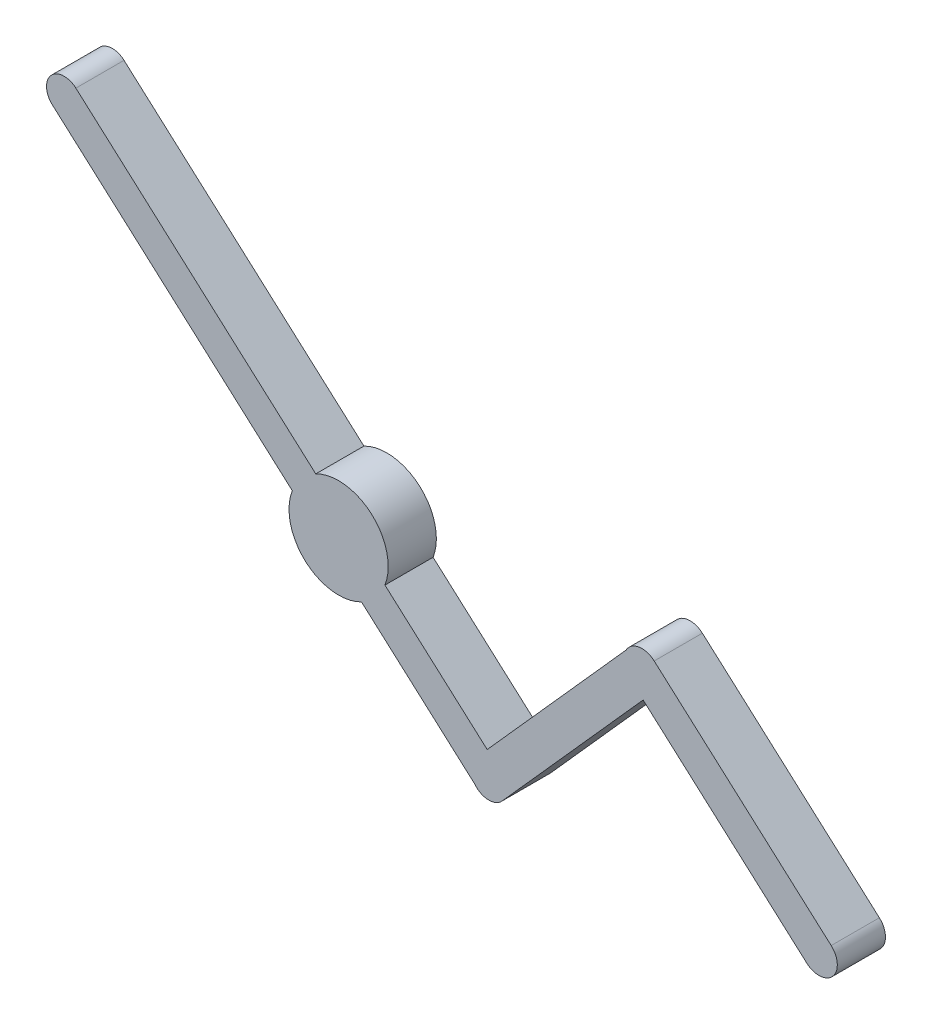
ISO-10303-21;
HEADER;
FILE_DESCRIPTION(('STEP AP214'),'2;1');
FILE_NAME('part.step','',(''),(''),'','','');
FILE_SCHEMA(('AUTOMOTIVE_DESIGN { 1 0 10303 214 1 1 1 1 }'));
ENDSEC;
DATA;
#1=APPLICATION_CONTEXT('core data for automotive mechanical design processes');
#2=APPLICATION_PROTOCOL_DEFINITION('international standard','automotive_design',2000,#1);
#3=PRODUCT_CONTEXT('',#1,'mechanical');
#4=PRODUCT('Part','Part','',(#3));
#5=PRODUCT_RELATED_PRODUCT_CATEGORY('part','',(#4));
#6=PRODUCT_DEFINITION_FORMATION('','',#4);
#7=PRODUCT_DEFINITION_CONTEXT('part definition',#1,'design');
#8=PRODUCT_DEFINITION('design','',#6,#7);
#9=PRODUCT_DEFINITION_SHAPE('','',#8);
#10=(LENGTH_UNIT() NAMED_UNIT(*) SI_UNIT(.MILLI.,.METRE.));
#11=(NAMED_UNIT(*) PLANE_ANGLE_UNIT() SI_UNIT($,.RADIAN.));
#12=(NAMED_UNIT(*) SI_UNIT($,.STERADIAN.) SOLID_ANGLE_UNIT());
#13=UNCERTAINTY_MEASURE_WITH_UNIT(LENGTH_MEASURE(1.E-05),#10,'distance_accuracy_value','');
#14=(GEOMETRIC_REPRESENTATION_CONTEXT(3) GLOBAL_UNCERTAINTY_ASSIGNED_CONTEXT((#13)) GLOBAL_UNIT_ASSIGNED_CONTEXT((#10,
#11,#12)) REPRESENTATION_CONTEXT('',''));
#15=CARTESIAN_POINT('',(0.,0.,0.));
#16=DIRECTION('',(0.,0.,1.));
#17=DIRECTION('',(1.,0.,0.));
#18=AXIS2_PLACEMENT_3D('',#15,#16,#17);
#19=CARTESIAN_POINT('',(144.167279134353,-128.666791198798,2.));
#20=DIRECTION('',(-0.746076463848962,0.665860278204541,0.));
#21=DIRECTION('',(-0.665860278204541,-0.746076463848962,0.));
#22=AXIS2_PLACEMENT_3D('',#19,#20,#21);
#23=PLANE('',#22);
#24=DIRECTION('',(0.665860278204541,0.746076463848962,0.));
#25=VECTOR('',#24,1.);
#26=CARTESIAN_POINT('',(144.167279134353,-128.666791198798,0.));
#27=LINE('',#26,#25);
#28=CARTESIAN_POINT('',(197.074273983325,-69.3860908449162,0.));
#29=VERTEX_POINT('',#28);
#30=CARTESIAN_POINT('',(202.925750043493,-62.8296874819783,0.));
#31=VERTEX_POINT('',#30);
#32=EDGE_CURVE('E148',#29,#31,#27,.T.);
#33=ORIENTED_EDGE('',*,*,#32,.T.);
#34=DIRECTION('',(0.,0.,-1.));
#35=VECTOR('',#34,1.);
#36=CARTESIAN_POINT('',(202.925750043493,-62.8296874819783,2.));
#37=LINE('',#36,#35);
#38=CARTESIAN_POINT('',(202.925750043493,-62.8296874819783,2.));
#39=VERTEX_POINT('',#38);
#40=EDGE_CURVE('E11',#39,#31,#37,.T.);
#41=ORIENTED_EDGE('',*,*,#40,.F.);
#42=DIRECTION('',(0.665860278204541,0.746076463848962,0.));
#43=VECTOR('',#42,1.);
#44=CARTESIAN_POINT('',(144.167279134353,-128.666791198798,2.));
#45=LINE('',#44,#43);
#46=CARTESIAN_POINT('',(197.074273983325,-69.3860908449162,2.));
#47=VERTEX_POINT('',#46);
#48=EDGE_CURVE('E181',#47,#39,#45,.T.);
#49=ORIENTED_EDGE('',*,*,#48,.F.);
#50=DIRECTION('',(0.,0.,-1.));
#51=VECTOR('',#50,1.);
#52=CARTESIAN_POINT('',(197.074273983325,-69.3860908449162,2.));
#53=LINE('',#52,#51);
#54=EDGE_CURVE('E144',#47,#29,#53,.T.);
#55=ORIENTED_EDGE('',*,*,#54,.T.);
#56=EDGE_LOOP('',(#33,#41,#49,#55));
#57=FACE_BOUND('',#56,.T.);
#58=ADVANCED_FACE('F16',(#57),#23,.F.);
#59=CARTESIAN_POINT('',(58.7584709091406,65.8371037168205,2.));
#60=DIRECTION('',(0.665860278204545,0.746076463848959,0.));
#61=DIRECTION('',(-0.746076463848959,0.665860278204545,0.));
#62=AXIS2_PLACEMENT_3D('',#59,#60,#61);
#63=PLANE('',#62);
#64=DIRECTION('',(0.746076463848959,-0.665860278204544,0.));
#65=VECTOR('',#64,1.);
#66=CARTESIAN_POINT('',(58.7584709091406,65.8371037168205,0.));
#67=LINE('',#66,#65);
#68=CARTESIAN_POINT('',(209.719946290777,-68.8933895589126,0.));
#69=VERTEX_POINT('',#68);
#70=EDGE_CURVE('E151',#31,#69,#67,.T.);
#71=ORIENTED_EDGE('',*,*,#70,.T.);
#72=DIRECTION('',(0.,0.,-1.));
#73=VECTOR('',#72,1.);
#74=CARTESIAN_POINT('',(209.719946290777,-68.8933895589126,2.));
#75=LINE('',#74,#73);
#76=CARTESIAN_POINT('',(209.719946290777,-68.8933895589126,2.));
#77=VERTEX_POINT('',#76);
#78=EDGE_CURVE('E24',#77,#69,#75,.T.);
#79=ORIENTED_EDGE('',*,*,#78,.F.);
#80=DIRECTION('',(0.746076463848959,-0.665860278204544,0.));
#81=VECTOR('',#80,1.);
#82=CARTESIAN_POINT('',(58.7584709091406,65.8371037168205,2.));
#83=LINE('',#82,#81);
#84=EDGE_CURVE('E93',#39,#77,#83,.T.);
#85=ORIENTED_EDGE('',*,*,#84,.F.);
#86=ORIENTED_EDGE('',*,*,#40,.T.);
#87=EDGE_LOOP('',(#71,#79,#85,#86));
#88=FACE_BOUND('',#87,.T.);
#89=ADVANCED_FACE('F262',(#88),#63,.F.);
#90=CARTESIAN_POINT('',(210.227354136382,-68.3248542917263,2.));
#91=DIRECTION('',(0.,0.,-1.));
#92=DIRECTION('',(-1.,0.,0.));
#93=AXIS2_PLACEMENT_3D('',#90,#91,#92);
#94=CYLINDRICAL_SURFACE('',#93,0.762033510953083);
#95=CARTESIAN_POINT('',(210.227354136382,-68.3248542917263,0.));
#96=DIRECTION('',(0.,0.,1.));
#97=DIRECTION('',(1.,0.,0.));
#98=AXIS2_PLACEMENT_3D('',#95,#96,#97);
#99=CIRCLE('',#98,0.762033510953083);
#100=CARTESIAN_POINT('',(210.734761981986,-67.75631902454,0.));
#101=VERTEX_POINT('',#100);
#102=EDGE_CURVE('E153',#69,#101,#99,.T.);
#103=ORIENTED_EDGE('',*,*,#102,.T.);
#104=DIRECTION('',(0.,0.,-1.));
#105=VECTOR('',#104,1.);
#106=CARTESIAN_POINT('',(210.734761981986,-67.75631902454,2.));
#107=LINE('',#106,#105);
#108=CARTESIAN_POINT('',(210.734761981986,-67.75631902454,2.));
#109=VERTEX_POINT('',#108);
#110=EDGE_CURVE('E200',#109,#101,#107,.T.);
#111=ORIENTED_EDGE('',*,*,#110,.F.);
#112=CARTESIAN_POINT('',(210.227354136382,-68.3248542917263,2.));
#113=DIRECTION('',(0.,0.,1.));
#114=DIRECTION('',(1.,0.,0.));
#115=AXIS2_PLACEMENT_3D('',#112,#113,#114);
#116=CIRCLE('',#115,0.762033510953083);
#117=EDGE_CURVE('E207',#77,#109,#116,.T.);
#118=ORIENTED_EDGE('',*,*,#117,.F.);
#119=ORIENTED_EDGE('',*,*,#78,.T.);
#120=EDGE_LOOP('',(#103,#111,#118,#119));
#121=FACE_BOUND('',#120,.T.);
#122=ADVANCED_FACE('F205',(#121),#94,.T.);
#123=CARTESIAN_POINT('',(59.7732866003492,66.974174251193,2.));
#124=DIRECTION('',(0.665860278204544,0.74607646384896,0.));
#125=DIRECTION('',(-0.74607646384896,0.665860278204544,0.));
#126=AXIS2_PLACEMENT_3D('',#123,#124,#125);
#127=PLANE('',#126);
#128=DIRECTION('',(0.74607646384896,-0.665860278204544,0.));
#129=VECTOR('',#128,1.);
#130=CARTESIAN_POINT('',(59.7732866003492,66.974174251193,0.));
#131=LINE('',#130,#129);
#132=CARTESIAN_POINT('',(203.385396716601,-61.1971382470234,0.));
#133=VERTEX_POINT('',#132);
#134=EDGE_CURVE('E156',#133,#101,#131,.T.);
#135=ORIENTED_EDGE('',*,*,#134,.F.);
#136=DIRECTION('',(0.,0.,-1.));
#137=VECTOR('',#136,1.);
#138=CARTESIAN_POINT('',(203.385396716601,-61.1971382470234,2.));
#139=LINE('',#138,#137);
#140=CARTESIAN_POINT('',(203.385396716601,-61.1971382470234,2.));
#141=VERTEX_POINT('',#140);
#142=EDGE_CURVE('E198',#141,#133,#139,.T.);
#143=ORIENTED_EDGE('',*,*,#142,.F.);
#144=DIRECTION('',(0.74607646384896,-0.665860278204544,0.));
#145=VECTOR('',#144,1.);
#146=CARTESIAN_POINT('',(59.7732866003492,66.974174251193,2.));
#147=LINE('',#146,#145);
#148=EDGE_CURVE('E218',#141,#109,#147,.T.);
#149=ORIENTED_EDGE('',*,*,#148,.T.);
#150=ORIENTED_EDGE('',*,*,#110,.T.);
#151=EDGE_LOOP('',(#135,#143,#149,#150));
#152=FACE_BOUND('',#151,.T.);
#153=ADVANCED_FACE('F214',(#152),#127,.T.);
#154=CARTESIAN_POINT('',(202.877988870997,-61.7656735142097,2.));
#155=DIRECTION('',(0.,0.,-1.));
#156=DIRECTION('',(-1.,0.,0.));
#157=AXIS2_PLACEMENT_3D('',#154,#155,#156);
#158=CYLINDRICAL_SURFACE('',#157,0.762033510953078);
#159=CARTESIAN_POINT('',(202.877988870997,-61.7656735142097,0.));
#160=DIRECTION('',(0.,0.,1.));
#161=DIRECTION('',(1.,0.,0.));
#162=AXIS2_PLACEMENT_3D('',#159,#160,#161);
#163=CIRCLE('',#162,0.762033510953078);
#164=CARTESIAN_POINT('',(202.213441705855,-61.3927497457028,0.));
#165=VERTEX_POINT('',#164);
#166=EDGE_CURVE('E159',#133,#165,#163,.T.);
#167=ORIENTED_EDGE('',*,*,#166,.T.);
#168=DIRECTION('',(0.,0.,-1.));
#169=VECTOR('',#168,1.);
#170=CARTESIAN_POINT('',(202.213441705855,-61.3927497457028,2.));
#171=LINE('',#170,#169);
#172=CARTESIAN_POINT('',(202.213441705855,-61.3927497457028,2.));
#173=VERTEX_POINT('',#172);
#174=EDGE_CURVE('E196',#173,#165,#171,.T.);
#175=ORIENTED_EDGE('',*,*,#174,.F.);
#176=CARTESIAN_POINT('',(202.877988870997,-61.7656735142097,2.));
#177=DIRECTION('',(0.,0.,1.));
#178=DIRECTION('',(1.,0.,0.));
#179=AXIS2_PLACEMENT_3D('',#176,#177,#178);
#180=CIRCLE('',#179,0.762033510953078);
#181=EDGE_CURVE('E219',#141,#173,#180,.T.);
#182=ORIENTED_EDGE('',*,*,#181,.F.);
#183=ORIENTED_EDGE('',*,*,#142,.T.);
#184=EDGE_LOOP('',(#167,#175,#182,#183));
#185=FACE_BOUND('',#184,.T.);
#186=ADVANCED_FACE('F275',(#185),#158,.T.);
#187=CARTESIAN_POINT('',(143.056941098152,-127.675833797634,2.));
#188=DIRECTION('',(-0.746076463848961,0.665860278204543,0.));
#189=DIRECTION('',(-0.665860278204543,-0.746076463848961,0.));
#190=AXIS2_PLACEMENT_3D('',#187,#188,#189);
#191=PLANE('',#190);
#192=DIRECTION('',(0.665860278204543,0.746076463848961,0.));
#193=VECTOR('',#192,1.);
#194=CARTESIAN_POINT('',(143.056941098152,-127.675833797634,0.));
#195=LINE('',#194,#193);
#196=CARTESIAN_POINT('',(196.450966632525,-67.8494301731958,0.));
#197=VERTEX_POINT('',#196);
#198=EDGE_CURVE('E162',#197,#165,#195,.T.);
#199=ORIENTED_EDGE('',*,*,#198,.F.);
#200=DIRECTION('',(0.,0.,-1.));
#201=VECTOR('',#200,1.);
#202=CARTESIAN_POINT('',(196.450966632525,-67.8494301731958,2.));
#203=LINE('',#202,#201);
#204=CARTESIAN_POINT('',(196.450966632525,-67.8494301731958,2.));
#205=VERTEX_POINT('',#204);
#206=EDGE_CURVE('E194',#205,#197,#203,.T.);
#207=ORIENTED_EDGE('',*,*,#206,.F.);
#208=DIRECTION('',(0.665860278204543,0.746076463848961,0.));
#209=VECTOR('',#208,1.);
#210=CARTESIAN_POINT('',(143.056941098152,-127.675833797634,2.));
#211=LINE('',#210,#209);
#212=EDGE_CURVE('E221',#205,#173,#211,.T.);
#213=ORIENTED_EDGE('',*,*,#212,.T.);
#214=ORIENTED_EDGE('',*,*,#174,.T.);
#215=EDGE_LOOP('',(#199,#207,#213,#214));
#216=FACE_BOUND('',#215,.T.);
#217=ADVANCED_FACE('F278',(#216),#191,.T.);
#218=CARTESIAN_POINT('',(53.3940255343725,59.8264036244382,2.));
#219=DIRECTION('',(0.665860278204543,0.74607646384896,0.));
#220=DIRECTION('',(-0.74607646384896,0.665860278204543,0.));
#221=AXIS2_PLACEMENT_3D('',#218,#219,#220);
#222=PLANE('',#221);
#223=DIRECTION('',(0.74607646384896,-0.665860278204543,0.));
#224=VECTOR('',#223,1.);
#225=CARTESIAN_POINT('',(53.3940255343725,59.8264036244382,0.));
#226=LINE('',#225,#224);
#227=CARTESIAN_POINT('',(192.204166739988,-64.0592350726353,0.));
#228=VERTEX_POINT('',#227);
#229=EDGE_CURVE('E165',#228,#197,#226,.T.);
#230=ORIENTED_EDGE('',*,*,#229,.F.);
#231=DIRECTION('',(0.,0.,-1.));
#232=VECTOR('',#231,1.);
#233=CARTESIAN_POINT('',(192.204166739988,-64.0592350726353,2.));
#234=LINE('',#233,#232);
#235=CARTESIAN_POINT('',(192.204166739988,-64.0592350726353,2.));
#236=VERTEX_POINT('',#235);
#237=EDGE_CURVE('E192',#236,#228,#234,.T.);
#238=ORIENTED_EDGE('',*,*,#237,.F.);
#239=DIRECTION('',(0.74607646384896,-0.665860278204543,0.));
#240=VECTOR('',#239,1.);
#241=CARTESIAN_POINT('',(53.3940255343725,59.8264036244382,2.));
#242=LINE('',#241,#240);
#243=EDGE_CURVE('E228',#236,#205,#242,.T.);
#244=ORIENTED_EDGE('',*,*,#243,.T.);
#245=ORIENTED_EDGE('',*,*,#206,.T.);
#246=EDGE_LOOP('',(#230,#238,#244,#245));
#247=FACE_BOUND('',#246,.T.);
#248=ADVANCED_FACE('F282',(#247),#222,.T.);
#249=CARTESIAN_POINT('',(190.281006735768,-63.3232178840935,2.));
#250=DIRECTION('',(0.,0.,-1.));
#251=DIRECTION('',(-1.,0.,0.));
#252=AXIS2_PLACEMENT_3D('',#249,#250,#251);
#253=CYLINDRICAL_SURFACE('',#252,2.05919054573817);
#254=CARTESIAN_POINT('',(190.281006735768,-63.3232178840935,0.));
#255=DIRECTION('',(0.,0.,1.));
#256=DIRECTION('',(1.,0.,0.));
#257=AXIS2_PLACEMENT_3D('',#254,#255,#256);
#258=CIRCLE('',#257,2.05919054573817);
#259=CARTESIAN_POINT('',(189.33190810235,-61.49579415444,0.));
#260=VERTEX_POINT('',#259);
#261=EDGE_CURVE('E168',#228,#260,#258,.T.);
#262=ORIENTED_EDGE('',*,*,#261,.T.);
#263=DIRECTION('',(0.,0.,-1.));
#264=VECTOR('',#263,1.);
#265=CARTESIAN_POINT('',(189.33190810235,-61.49579415444,2.));
#266=LINE('',#265,#264);
#267=CARTESIAN_POINT('',(189.33190810235,-61.49579415444,2.));
#268=VERTEX_POINT('',#267);
#269=EDGE_CURVE('E190',#268,#260,#266,.T.);
#270=ORIENTED_EDGE('',*,*,#269,.F.);
#271=CARTESIAN_POINT('',(190.281006735768,-63.3232178840935,2.));
#272=DIRECTION('',(0.,0.,1.));
#273=DIRECTION('',(1.,0.,0.));
#274=AXIS2_PLACEMENT_3D('',#271,#272,#273);
#275=CIRCLE('',#274,2.05919054573817);
#276=EDGE_CURVE('E231',#236,#268,#275,.T.);
#277=ORIENTED_EDGE('',*,*,#276,.F.);
#278=ORIENTED_EDGE('',*,*,#237,.T.);
#279=EDGE_LOOP('',(#262,#270,#277,#278));
#280=FACE_BOUND('',#279,.T.);
#281=ADVANCED_FACE('F286',(#280),#253,.T.);
#282=CARTESIAN_POINT('',(53.3940255343725,59.8264036244382,2.));
#283=DIRECTION('',(0.665860278204543,0.74607646384896,0.));
#284=DIRECTION('',(-0.74607646384896,0.665860278204543,0.));
#285=AXIS2_PLACEMENT_3D('',#282,#283,#284);
#286=PLANE('',#285);
#287=DIRECTION('',(0.74607646384896,-0.665860278204543,0.));
#288=VECTOR('',#287,1.);
#289=CARTESIAN_POINT('',(53.3940255343725,59.8264036244382,0.));
#290=LINE('',#289,#288);
#291=CARTESIAN_POINT('',(179.370166114003,-52.6051125511868,0.));
#292=VERTEX_POINT('',#291);
#293=EDGE_CURVE('E171',#292,#260,#290,.T.);
#294=ORIENTED_EDGE('',*,*,#293,.F.);
#295=DIRECTION('',(0.,0.,-1.));
#296=VECTOR('',#295,1.);
#297=CARTESIAN_POINT('',(179.370166114003,-52.6051125511868,2.));
#298=LINE('',#297,#296);
#299=CARTESIAN_POINT('',(179.370166114003,-52.6051125511868,2.));
#300=VERTEX_POINT('',#299);
#301=EDGE_CURVE('E188',#300,#292,#298,.T.);
#302=ORIENTED_EDGE('',*,*,#301,.F.);
#303=DIRECTION('',(0.74607646384896,-0.665860278204543,0.));
#304=VECTOR('',#303,1.);
#305=CARTESIAN_POINT('',(53.3940255343725,59.8264036244382,2.));
#306=LINE('',#305,#304);
#307=EDGE_CURVE('E233',#300,#268,#306,.T.);
#308=ORIENTED_EDGE('',*,*,#307,.T.);
#309=ORIENTED_EDGE('',*,*,#269,.T.);
#310=EDGE_LOOP('',(#294,#302,#308,#309));
#311=FACE_BOUND('',#310,.T.);
#312=ADVANCED_FACE('F290',(#311),#286,.T.);
#313=CARTESIAN_POINT('',(178.883135428603,-53.1508158217426,2.));
#314=DIRECTION('',(0.,0.,-1.));
#315=DIRECTION('',(-1.,0.,0.));
#316=AXIS2_PLACEMENT_3D('',#313,#314,#315);
#317=CYLINDRICAL_SURFACE('',#316,0.73143075408193);
#318=CARTESIAN_POINT('',(178.883135428603,-53.1508158217426,0.));
#319=DIRECTION('',(0.,0.,1.));
#320=DIRECTION('',(1.,0.,0.));
#321=AXIS2_PLACEMENT_3D('',#318,#319,#320);
#322=CIRCLE('',#321,0.73143075408193);
#323=CARTESIAN_POINT('',(178.396104743202,-53.6965190922984,0.));
#324=VERTEX_POINT('',#323);
#325=EDGE_CURVE('E174',#292,#324,#322,.T.);
#326=ORIENTED_EDGE('',*,*,#325,.T.);
#327=DIRECTION('',(0.,0.,-1.));
#328=VECTOR('',#327,1.);
#329=CARTESIAN_POINT('',(178.396104743202,-53.6965190922984,2.));
#330=LINE('',#329,#328);
#331=CARTESIAN_POINT('',(178.396104743202,-53.6965190922984,2.));
#332=VERTEX_POINT('',#331);
#333=EDGE_CURVE('E185',#332,#324,#330,.T.);
#334=ORIENTED_EDGE('',*,*,#333,.F.);
#335=CARTESIAN_POINT('',(178.883135428603,-53.1508158217426,2.));
#336=DIRECTION('',(0.,0.,1.));
#337=DIRECTION('',(1.,0.,0.));
#338=AXIS2_PLACEMENT_3D('',#335,#336,#337);
#339=CIRCLE('',#338,0.73143075408193);
#340=EDGE_CURVE('E236',#300,#332,#339,.T.);
#341=ORIENTED_EDGE('',*,*,#340,.F.);
#342=ORIENTED_EDGE('',*,*,#301,.T.);
#343=EDGE_LOOP('',(#326,#334,#341,#342));
#344=FACE_BOUND('',#343,.T.);
#345=ADVANCED_FACE('F241',(#344),#317,.T.);
#346=CARTESIAN_POINT('',(52.4199641635717,58.7349970833265,2.));
#347=DIRECTION('',(0.665860278204542,0.746076463848961,0.));
#348=DIRECTION('',(-0.746076463848961,0.665860278204542,0.));
#349=AXIS2_PLACEMENT_3D('',#346,#347,#348);
#350=PLANE('',#349);
#351=DIRECTION('',(0.746076463848961,-0.665860278204542,0.));
#352=VECTOR('',#351,1.);
#353=CARTESIAN_POINT('',(52.4199641635717,58.7349970833265,0.));
#354=LINE('',#353,#352);
#355=CARTESIAN_POINT('',(188.357846731549,-62.5872006955517,0.));
#356=VERTEX_POINT('',#355);
#357=EDGE_CURVE('E176',#324,#356,#354,.T.);
#358=ORIENTED_EDGE('',*,*,#357,.T.);
#359=DIRECTION('',(0.,0.,-1.));
#360=VECTOR('',#359,1.);
#361=CARTESIAN_POINT('',(188.357846731549,-62.5872006955517,2.));
#362=LINE('',#361,#360);
#363=CARTESIAN_POINT('',(188.357846731549,-62.5872006955517,2.));
#364=VERTEX_POINT('',#363);
#365=EDGE_CURVE('E139',#364,#356,#362,.T.);
#366=ORIENTED_EDGE('',*,*,#365,.F.);
#367=DIRECTION('',(0.746076463848961,-0.665860278204542,0.));
#368=VECTOR('',#367,1.);
#369=CARTESIAN_POINT('',(52.4199641635717,58.7349970833265,2.));
#370=LINE('',#369,#368);
#371=EDGE_CURVE('E130',#332,#364,#370,.T.);
#372=ORIENTED_EDGE('',*,*,#371,.F.);
#373=ORIENTED_EDGE('',*,*,#333,.T.);
#374=EDGE_LOOP('',(#358,#366,#372,#373));
#375=FACE_BOUND('',#374,.T.);
#376=ADVANCED_FACE('F245',(#375),#350,.F.);
#377=CARTESIAN_POINT('',(190.281006735768,-63.3232178840935,2.));
#378=DIRECTION('',(0.,0.,-1.));
#379=DIRECTION('',(-1.,0.,0.));
#380=AXIS2_PLACEMENT_3D('',#377,#378,#379);
#381=CYLINDRICAL_SURFACE('',#380,2.05919054573817);
#382=CARTESIAN_POINT('',(190.281006735768,-63.3232178840935,0.));
#383=DIRECTION('',(0.,0.,1.));
#384=DIRECTION('',(1.,0.,0.));
#385=AXIS2_PLACEMENT_3D('',#382,#383,#384);
#386=CIRCLE('',#385,2.05919054573817);
#387=CARTESIAN_POINT('',(191.230105369187,-65.150641613747,0.));
#388=VERTEX_POINT('',#387);
#389=EDGE_CURVE('E138',#356,#388,#386,.T.);
#390=ORIENTED_EDGE('',*,*,#389,.T.);
#391=DIRECTION('',(0.,0.,-1.));
#392=VECTOR('',#391,1.);
#393=CARTESIAN_POINT('',(191.230105369187,-65.150641613747,2.));
#394=LINE('',#393,#392);
#395=CARTESIAN_POINT('',(191.230105369187,-65.150641613747,2.));
#396=VERTEX_POINT('',#395);
#397=EDGE_CURVE('E135',#396,#388,#394,.T.);
#398=ORIENTED_EDGE('',*,*,#397,.F.);
#399=CARTESIAN_POINT('',(190.281006735768,-63.3232178840935,2.));
#400=DIRECTION('',(0.,0.,1.));
#401=DIRECTION('',(1.,0.,0.));
#402=AXIS2_PLACEMENT_3D('',#399,#400,#401);
#403=CIRCLE('',#402,2.05919054573817);
#404=EDGE_CURVE('E124',#364,#396,#403,.T.);
#405=ORIENTED_EDGE('',*,*,#404,.F.);
#406=ORIENTED_EDGE('',*,*,#365,.T.);
#407=EDGE_LOOP('',(#390,#398,#405,#406));
#408=FACE_BOUND('',#407,.T.);
#409=ADVANCED_FACE('F136',(#408),#381,.T.);
#410=CARTESIAN_POINT('',(52.4199641635717,58.7349970833265,2.));
#411=DIRECTION('',(0.665860278204542,0.746076463848961,0.));
#412=DIRECTION('',(-0.746076463848961,0.665860278204542,0.));
#413=AXIS2_PLACEMENT_3D('',#410,#411,#412);
#414=PLANE('',#413);
#415=DIRECTION('',(0.746076463848961,-0.665860278204542,0.));
#416=VECTOR('',#415,1.);
#417=CARTESIAN_POINT('',(52.4199641635717,58.7349970833265,0.));
#418=LINE('',#417,#416);
#419=CARTESIAN_POINT('',(195.929993041767,-69.3452096839548,0.));
#420=VERTEX_POINT('',#419);
#421=EDGE_CURVE('E79',#388,#420,#418,.T.);
#422=ORIENTED_EDGE('',*,*,#421,.T.);
#423=DIRECTION('',(0.,0.,-1.));
#424=VECTOR('',#423,1.);
#425=CARTESIAN_POINT('',(195.929993041767,-69.3452096839548,2.));
#426=LINE('',#425,#424);
#427=CARTESIAN_POINT('',(195.929993041767,-69.3452096839548,2.));
#428=VERTEX_POINT('',#427);
#429=EDGE_CURVE('E140',#428,#420,#426,.T.);
#430=ORIENTED_EDGE('',*,*,#429,.F.);
#431=DIRECTION('',(0.746076463848961,-0.665860278204542,0.));
#432=VECTOR('',#431,1.);
#433=CARTESIAN_POINT('',(52.4199641635717,58.7349970833265,2.));
#434=LINE('',#433,#432);
#435=EDGE_CURVE('E128',#396,#428,#434,.T.);
#436=ORIENTED_EDGE('',*,*,#435,.F.);
#437=ORIENTED_EDGE('',*,*,#397,.T.);
#438=EDGE_LOOP('',(#422,#430,#436,#437));
#439=FACE_BOUND('',#438,.T.);
#440=ADVANCED_FACE('F142',(#439),#414,.F.);
#441=CARTESIAN_POINT('',(196.519104965224,-68.8906121443339,2.));
#442=DIRECTION('',(0.,0.,-1.));
#443=DIRECTION('',(-1.,0.,0.));
#444=AXIS2_PLACEMENT_3D('',#441,#442,#443);
#445=CYLINDRICAL_SURFACE('',#444,0.744118123277038);
#446=CARTESIAN_POINT('',(196.519104965224,-68.8906121443339,0.));
#447=DIRECTION('',(0.,0.,1.));
#448=DIRECTION('',(1.,0.,0.));
#449=AXIS2_PLACEMENT_3D('',#446,#447,#448);
#450=CIRCLE('',#449,0.744118123277038);
#451=EDGE_CURVE('E85',#420,#29,#450,.T.);
#452=ORIENTED_EDGE('',*,*,#451,.T.);
#453=ORIENTED_EDGE('',*,*,#54,.F.);
#454=CARTESIAN_POINT('',(196.519104965224,-68.8906121443339,2.));
#455=DIRECTION('',(0.,0.,1.));
#456=DIRECTION('',(1.,0.,0.));
#457=AXIS2_PLACEMENT_3D('',#454,#455,#456);
#458=CIRCLE('',#457,0.744118123277038);
#459=EDGE_CURVE('E32',#428,#47,#458,.T.);
#460=ORIENTED_EDGE('',*,*,#459,.F.);
#461=ORIENTED_EDGE('',*,*,#429,.T.);
#462=EDGE_LOOP('',(#452,#453,#460,#461));
#463=FACE_BOUND('',#462,.T.);
#464=ADVANCED_FACE('F249',(#463),#445,.T.);
#465=CARTESIAN_POINT('',(0.,0.,2.));
#466=DIRECTION('',(0.,0.,1.));
#467=DIRECTION('',(1.,0.,0.));
#468=AXIS2_PLACEMENT_3D('',#465,#466,#467);
#469=PLANE('',#468);
#470=ORIENTED_EDGE('',*,*,#48,.T.);
#471=ORIENTED_EDGE('',*,*,#84,.T.);
#472=ORIENTED_EDGE('',*,*,#117,.T.);
#473=ORIENTED_EDGE('',*,*,#148,.F.);
#474=ORIENTED_EDGE('',*,*,#181,.T.);
#475=ORIENTED_EDGE('',*,*,#212,.F.);
#476=ORIENTED_EDGE('',*,*,#243,.F.);
#477=ORIENTED_EDGE('',*,*,#276,.T.);
#478=ORIENTED_EDGE('',*,*,#307,.F.);
#479=ORIENTED_EDGE('',*,*,#340,.T.);
#480=ORIENTED_EDGE('',*,*,#371,.T.);
#481=ORIENTED_EDGE('',*,*,#404,.T.);
#482=ORIENTED_EDGE('',*,*,#435,.T.);
#483=ORIENTED_EDGE('',*,*,#459,.T.);
#484=EDGE_LOOP('',(#470,#471,#472,#473,#474,#475,#476,#477,#478,#479,#480,#481,#482,#483));
#485=FACE_BOUND('',#484,.T.);
#486=ADVANCED_FACE('F126',(#485),#469,.T.);
#487=CARTESIAN_POINT('',(0.,0.,0.));
#488=DIRECTION('',(0.,0.,1.));
#489=DIRECTION('',(1.,0.,0.));
#490=AXIS2_PLACEMENT_3D('',#487,#488,#489);
#491=PLANE('',#490);
#492=ORIENTED_EDGE('',*,*,#32,.F.);
#493=ORIENTED_EDGE('',*,*,#451,.F.);
#494=ORIENTED_EDGE('',*,*,#421,.F.);
#495=ORIENTED_EDGE('',*,*,#389,.F.);
#496=ORIENTED_EDGE('',*,*,#357,.F.);
#497=ORIENTED_EDGE('',*,*,#325,.F.);
#498=ORIENTED_EDGE('',*,*,#293,.T.);
#499=ORIENTED_EDGE('',*,*,#261,.F.);
#500=ORIENTED_EDGE('',*,*,#229,.T.);
#501=ORIENTED_EDGE('',*,*,#198,.T.);
#502=ORIENTED_EDGE('',*,*,#166,.F.);
#503=ORIENTED_EDGE('',*,*,#134,.T.);
#504=ORIENTED_EDGE('',*,*,#102,.F.);
#505=ORIENTED_EDGE('',*,*,#70,.F.);
#506=EDGE_LOOP('',(#492,#493,#494,#495,#496,#497,#498,#499,#500,#501,#502,#503,#504,#505));
#507=FACE_BOUND('',#506,.T.);
#508=ADVANCED_FACE('F210',(#507),#491,.F.);
#509=CLOSED_SHELL('',(#58,#89,#122,#153,#186,#217,#248,#281,#312,#345,#376,#409,#440,#464,#486,#508));
#510=MANIFOLD_SOLID_BREP('B1',#509);
#511=ADVANCED_BREP_SHAPE_REPRESENTATION('',(#18,#510),#14);
#512=SHAPE_DEFINITION_REPRESENTATION(#9,#511);
ENDSEC;
END-ISO-10303-21;
